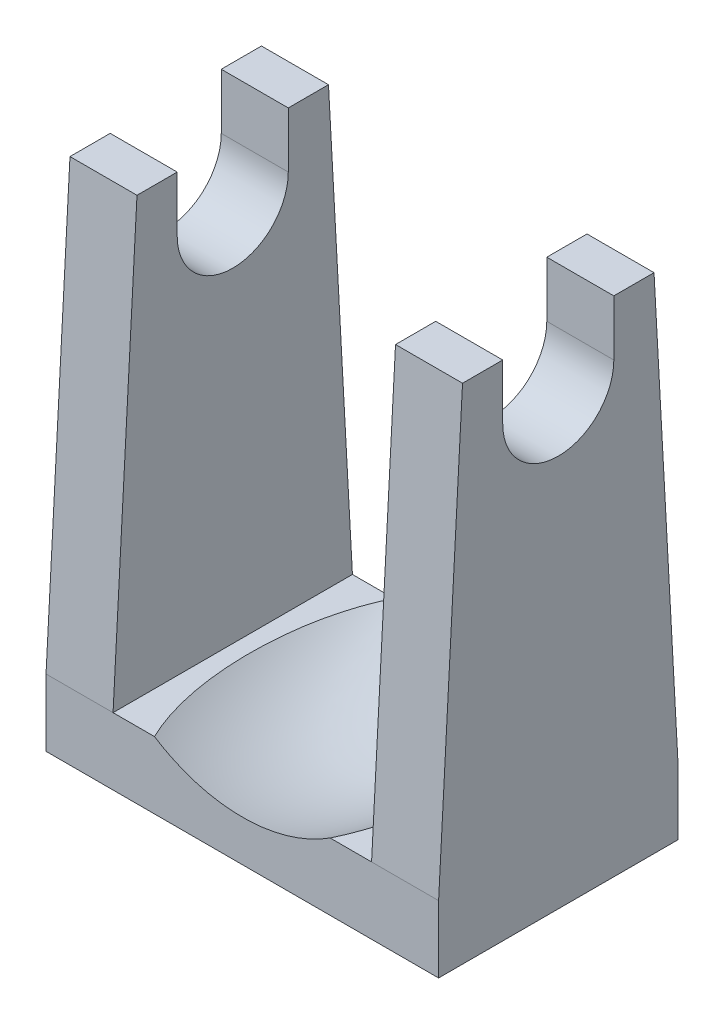
ISO-10303-21;
HEADER;
FILE_DESCRIPTION(('STEP AP214'),'2;1');
FILE_NAME('part.step','',(''),(''),'','','');
FILE_SCHEMA(('AUTOMOTIVE_DESIGN { 1 0 10303 214 1 1 1 1 }'));
ENDSEC;
DATA;
#1=APPLICATION_CONTEXT('core data for automotive mechanical design processes');
#2=APPLICATION_PROTOCOL_DEFINITION('international standard','automotive_design',2000,#1);
#3=PRODUCT_CONTEXT('',#1,'mechanical');
#4=PRODUCT('Part','Part','',(#3));
#5=PRODUCT_RELATED_PRODUCT_CATEGORY('part','',(#4));
#6=PRODUCT_DEFINITION_FORMATION('','',#4);
#7=PRODUCT_DEFINITION_CONTEXT('part definition',#1,'design');
#8=PRODUCT_DEFINITION('design','',#6,#7);
#9=PRODUCT_DEFINITION_SHAPE('','',#8);
#10=(LENGTH_UNIT() NAMED_UNIT(*) SI_UNIT(.MILLI.,.METRE.));
#11=(NAMED_UNIT(*) PLANE_ANGLE_UNIT() SI_UNIT($,.RADIAN.));
#12=(NAMED_UNIT(*) SI_UNIT($,.STERADIAN.) SOLID_ANGLE_UNIT());
#13=UNCERTAINTY_MEASURE_WITH_UNIT(LENGTH_MEASURE(1.E-05),#10,'distance_accuracy_value','');
#14=(GEOMETRIC_REPRESENTATION_CONTEXT(3) GLOBAL_UNCERTAINTY_ASSIGNED_CONTEXT((#13)) GLOBAL_UNIT_ASSIGNED_CONTEXT((#10,
#11,#12)) REPRESENTATION_CONTEXT('',''));
#15=CARTESIAN_POINT('',(0.,0.,0.));
#16=DIRECTION('',(0.,0.,1.));
#17=DIRECTION('',(1.,0.,0.));
#18=AXIS2_PLACEMENT_3D('',#15,#16,#17);
#19=CARTESIAN_POINT('',(-3.429,1.778,3.175));
#20=DIRECTION('',(0.,-1.,0.));
#21=DIRECTION('',(0.,0.,-1.));
#22=AXIS2_PLACEMENT_3D('',#19,#20,#21);
#23=PLANE('',#22);
#24=DIRECTION('',(-1.,0.,0.));
#25=VECTOR('',#24,1.);
#26=CARTESIAN_POINT('',(-3.429,1.778,3.175));
#27=LINE('',#26,#25);
#28=CARTESIAN_POINT('',(-2.33012916433058,1.778,3.175));
#29=VERTEX_POINT('',#28);
#30=CARTESIAN_POINT('',(-3.429,1.778,3.175));
#31=VERTEX_POINT('',#30);
#32=EDGE_CURVE('E193',#29,#31,#27,.T.);
#33=ORIENTED_EDGE('',*,*,#32,.F.);
#34=CARTESIAN_POINT('',(2.98438116142537,1.778,0.));
#35=CARTESIAN_POINT('',(2.98438272635959,1.778,0.188375752277281));
#36=CARTESIAN_POINT('',(2.97853054675383,1.778,0.376762294481809));
#37=CARTESIAN_POINT('',(2.95489329729941,1.778,0.752833492124692));
#38=CARTESIAN_POINT('',(2.93710543895308,1.778,0.940517973236571));
#39=CARTESIAN_POINT('',(2.88891956149637,1.778,1.31412711390979));
#40=CARTESIAN_POINT('',(2.85853231048301,1.778,1.50005313788849));
#41=CARTESIAN_POINT('',(2.78399985130601,1.778,1.86906268777694));
#42=CARTESIAN_POINT('',(2.73986120685217,1.778,2.05214752614319));
#43=CARTESIAN_POINT('',(2.62543525306633,1.778,2.45149675806916));
#44=CARTESIAN_POINT('',(2.55162542716161,1.778,2.66677868343442));
#45=CARTESIAN_POINT('',(2.37774587960668,1.778,3.08664930500776));
#46=CARTESIAN_POINT('',(2.27769213710583,1.778,3.29124441751451));
#47=CARTESIAN_POINT('',(2.06733376315394,1.778,3.64778486721544));
#48=CARTESIAN_POINT('',(1.96200280516021,1.778,3.80262871889689));
#49=CARTESIAN_POINT('',(1.72816604783605,1.778,4.09381598928918));
#50=CARTESIAN_POINT('',(1.59970584633227,1.778,4.2301948998803));
#51=CARTESIAN_POINT('',(1.35920540316977,1.778,4.44018988243004));
#52=CARTESIAN_POINT('',(1.25309609429582,1.778,4.5205685007959));
#53=CARTESIAN_POINT('',(1.02931463200035,1.778,4.6634022670725));
#54=CARTESIAN_POINT('',(0.911648926005241,1.778,4.72586733372503));
#55=CARTESIAN_POINT('',(0.665681704602969,1.778,4.82910505898052));
#56=CARTESIAN_POINT('',(0.537289945644001,1.778,4.86966648499127));
#57=CARTESIAN_POINT('',(0.275008521425509,1.778,4.92451458026312));
#58=CARTESIAN_POINT('',(0.14112446225444,1.778,4.93882739172373));
#59=CARTESIAN_POINT('',(-0.107765842609485,1.778,4.93976766275565));
#60=CARTESIAN_POINT('',(-0.222772378331092,1.778,4.9300138690261));
#61=CARTESIAN_POINT('',(-0.449376447079669,1.778,4.89091532117441));
#62=CARTESIAN_POINT('',(-0.56097390510031,1.778,4.86157013632783));
#63=CARTESIAN_POINT('',(-0.775974412969873,1.778,4.78596863085079));
#64=CARTESIAN_POINT('',(-0.879487474284177,1.778,4.74002054680641));
#65=CARTESIAN_POINT('',(-1.07875024997038,1.778,4.63369918691537));
#66=CARTESIAN_POINT('',(-1.17449691694084,1.778,4.57332028498342));
#67=CARTESIAN_POINT('',(-1.40274695752104,1.778,4.40781133679853));
#68=CARTESIAN_POINT('',(-1.52993205295908,1.778,4.29533744069146));
#69=CARTESIAN_POINT('',(-1.76471634930494,1.778,4.0515290543505));
#70=CARTESIAN_POINT('',(-1.87226749759353,1.778,3.92014966186016));
#71=CARTESIAN_POINT('',(-2.11922811867788,1.778,3.57404191351486));
#72=CARTESIAN_POINT('',(-2.2468953866249,1.778,3.35098771388371));
#73=CARTESIAN_POINT('',(-2.46683088735922,1.778,2.88827173205634));
#74=CARTESIAN_POINT('',(-2.55902905089879,1.778,2.6485781696899));
#75=CARTESIAN_POINT('',(-2.70019314881656,1.778,2.20287899437022));
#76=CARTESIAN_POINT('',(-2.75390391604966,1.778,1.99833129421325));
#77=CARTESIAN_POINT('',(-2.84366524270527,1.778,1.58530553226664));
#78=CARTESIAN_POINT('',(-2.87970371777699,1.778,1.37682488200001));
#79=CARTESIAN_POINT('',(-2.93590986825146,1.778,0.957050130852615));
#80=CARTESIAN_POINT('',(-2.95602272489735,1.778,0.745748836202624));
#81=CARTESIAN_POINT('',(-2.98116099586802,1.778,0.322323616670094));
#82=CARTESIAN_POINT('',(-2.98619035113952,1.778,0.110199921166225));
#83=CARTESIAN_POINT('',(-2.98128641807067,1.778,-0.32649510456757));
#84=CARTESIAN_POINT('',(-2.97044610573199,1.778,-0.55105696751252));
#85=CARTESIAN_POINT('',(-2.93152021229603,1.778,-0.998816015956261));
#86=CARTESIAN_POINT('',(-2.90342663145885,1.778,-1.22201251987289));
#87=CARTESIAN_POINT('',(-2.82863180914895,1.778,-1.66411508569352));
#88=CARTESIAN_POINT('',(-2.7820294151986,1.778,-1.88303755991614));
#89=CARTESIAN_POINT('',(-2.66778514033962,1.778,-2.31518703242224));
#90=CARTESIAN_POINT('',(-2.60016861819189,1.778,-2.52842056084824));
#91=CARTESIAN_POINT('',(-2.45074083892586,1.778,-2.91877723824966));
#92=CARTESIAN_POINT('',(-2.3718791386167,1.778,-3.09701424431371));
#93=CARTESIAN_POINT('',(-2.19264958802553,1.778,-3.44282784447795));
#94=CARTESIAN_POINT('',(-2.09225751238631,1.778,-3.61039215221711));
#95=CARTESIAN_POINT('',(-1.86561812436685,1.778,-3.93082410091077));
#96=CARTESIAN_POINT('',(-1.73903845538131,1.778,-4.08346146219153));
#97=CARTESIAN_POINT('',(-1.45894217611175,1.778,-4.36162880585181));
#98=CARTESIAN_POINT('',(-1.30552899861628,1.778,-4.48725888943294));
#99=CARTESIAN_POINT('',(-1.03730929838843,1.778,-4.65820157668542));
#100=CARTESIAN_POINT('',(-0.930328115089778,1.778,-4.71582533368597));
#101=CARTESIAN_POINT('',(-0.708349481951244,1.778,-4.8128692304437));
#102=CARTESIAN_POINT('',(-0.593357958767572,1.778,-4.85230266753396));
#103=CARTESIAN_POINT('',(-0.3574461675898,1.778,-4.91036116913119));
#104=CARTESIAN_POINT('',(-0.236495152339304,1.778,-4.92886315794765));
#105=CARTESIAN_POINT('',(0.00674519495167258,1.778,-4.94310349441751));
#106=CARTESIAN_POINT('',(0.129034195322047,1.778,-4.93884736142011));
#107=CARTESIAN_POINT('',(0.360360290894705,1.778,-4.90929060122634));
#108=CARTESIAN_POINT('',(0.469638245756384,1.778,-4.88581529919473));
#109=CARTESIAN_POINT('',(0.683008609989167,1.778,-4.8217381072197));
#110=CARTESIAN_POINT('',(0.787100080621293,1.778,-4.78113312935321));
#111=CARTESIAN_POINT('',(0.993430259629429,1.778,-4.68256678262549));
#112=CARTESIAN_POINT('',(1.09528202517341,1.778,-4.62380328959848));
#113=CARTESIAN_POINT('',(1.28984264952473,1.778,-4.49280988846548));
#114=CARTESIAN_POINT('',(1.38254710659762,1.778,-4.42057354500668));
#115=CARTESIAN_POINT('',(1.61174022479799,1.778,-4.21832294993521));
#116=CARTESIAN_POINT('',(1.74074017799112,1.778,-4.07981331581754));
#117=CARTESIAN_POINT('',(1.97536300717008,1.778,-3.78413330923895));
#118=CARTESIAN_POINT('',(2.08091732250443,1.778,-3.62691022074898));
#119=CARTESIAN_POINT('',(2.25025833062576,1.778,-3.33576636853946));
#120=CARTESIAN_POINT('',(2.31813981769369,1.778,-3.20417377125563));
#121=CARTESIAN_POINT('',(2.44222699894319,1.778,-2.935534530963));
#122=CARTESIAN_POINT('',(2.4984255114953,1.778,-2.79848459458541));
#123=CARTESIAN_POINT('',(2.60031203371731,1.778,-2.52042327023397));
#124=CARTESIAN_POINT('',(2.64598965151788,1.778,-2.37940811858745));
#125=CARTESIAN_POINT('',(2.72777198830576,1.778,-2.09468235512664));
#126=CARTESIAN_POINT('',(2.76387847212189,1.778,-1.9509722454778));
#127=CARTESIAN_POINT('',(2.82811409645471,1.778,-1.6582194036479));
#128=CARTESIAN_POINT('',(2.85603354977997,1.778,-1.50913106146254));
#129=CARTESIAN_POINT('',(2.9034177410827,1.778,-1.20958643268488));
#130=CARTESIAN_POINT('',(2.92288004918409,1.778,-1.05912976561035));
#131=CARTESIAN_POINT('',(2.95382603599382,1.778,-0.757405342928155));
#132=CARTESIAN_POINT('',(2.96530975459527,1.778,-0.606137591379734));
#133=CARTESIAN_POINT('',(2.98058599786904,1.778,-0.303248844667521));
#134=CARTESIAN_POINT('',(2.98437990177431,1.778,-0.151627917733611));
#135=CARTESIAN_POINT('',(2.98438116142537,1.778,0.));
#136=B_SPLINE_CURVE_WITH_KNOTS('',3,(#34,#35,#36,#37,#38,#39,#40,#41,#42,#43,#44,#45,#46,#47,
#48,#49,#50,#51,#52,#53,#54,#55,#56,#57,#58,#59,#60,#61,#62,#63,#64,#65,#66,#67,#68,#69,#70,#71,
#72,#73,#74,#75,#76,#77,#78,#79,#80,#81,#82,#83,#84,#85,#86,#87,#88,#89,#90,#91,#92,#93,#94,#95,
#96,#97,#98,#99,#100,#101,#102,#103,#104,#105,#106,#107,#108,#109,#110,#111,#112,#113,#114,#115,
#116,#117,#118,#119,#120,#121,#122,#123,#124,#125,#126,#127,#128,#129,#130,#131,#132,#133,#134,
#135),.UNSPECIFIED.,.T.,.F.,(4,2,2,2,2,2,2,2,2,2,2,2,2,2,2,2,2,2,2,2,2,2,2,2,2,2,2,2,2,2,2,2,2,
2,2,2,2,2,2,2,2,2,2,2,2,2,2,2,2,2,4),(0.,0.565052206929372,1.13023647133593,1.69493869225983,
2.25937178572984,2.94071710312844,3.62164852851744,4.18168751529776,4.74063427491599,
5.13855701621915,5.53625900022334,5.93773076100263,6.33880246004008,6.68332872933179,
7.02786257341881,7.36630362108927,7.70487683127121,8.21134974168912,8.71904605777397,
9.4857711437014,10.2540032115793,10.8876007408403,11.5216309233682,12.157834174318,
12.7938711865692,13.4677091367364,14.1418597582316,14.8124574308279,15.4822489826829,
16.0657808175219,16.6499727028836,17.242091762273,17.8319768035689,18.1951331529826,
18.5580236085849,18.9230369255824,19.2879617227722,19.6217708087132,19.9556400952996,
20.3071097614319,20.6587477401953,21.2233630161322,21.7896082391106,22.2332143425222,
22.6770923334937,23.1214068964601,23.5656394748406,24.0204161129767,24.4753233296194,
24.9302282717005,25.3850516155317),.UNSPECIFIED.);
#137=CARTESIAN_POINT('',(-2.33012916433042,1.778,-3.17500000000018));
#138=VERTEX_POINT('',#137);
#139=EDGE_CURVE('E53',#29,#138,#136,.T.);
#140=ORIENTED_EDGE('',*,*,#139,.T.);
#141=DIRECTION('',(-1.,0.,0.));
#142=VECTOR('',#141,1.);
#143=CARTESIAN_POINT('',(-3.429,1.778,-3.175));
#144=LINE('',#143,#142);
#145=CARTESIAN_POINT('',(-3.429,1.778,-3.175));
#146=VERTEX_POINT('',#145);
#147=EDGE_CURVE('E210',#138,#146,#144,.T.);
#148=ORIENTED_EDGE('',*,*,#147,.T.);
#149=DIRECTION('',(0.,0.,-1.));
#150=VECTOR('',#149,1.);
#151=CARTESIAN_POINT('',(-3.429,1.778,3.175));
#152=LINE('',#151,#150);
#153=EDGE_CURVE('E216',#31,#146,#152,.T.);
#154=ORIENTED_EDGE('',*,*,#153,.F.);
#155=EDGE_LOOP('',(#33,#140,#148,#154));
#156=FACE_BOUND('',#155,.T.);
#157=ADVANCED_FACE('F32',(#156),#23,.F.);
#158=CARTESIAN_POINT('',(5.207,13.3472,3.175));
#159=DIRECTION('',(0.,-1.,0.));
#160=DIRECTION('',(1.,0.,0.));
#161=AXIS2_PLACEMENT_3D('',#158,#159,#160);
#162=PLANE('',#161);
#163=DIRECTION('',(1.,0.,0.));
#164=VECTOR('',#163,1.);
#165=CARTESIAN_POINT('',(-5.207,13.3472,-2.54));
#166=LINE('',#165,#164);
#167=CARTESIAN_POINT('',(3.429,13.3472,-2.54));
#168=VERTEX_POINT('',#167);
#169=CARTESIAN_POINT('',(5.207,13.3472,-2.54));
#170=VERTEX_POINT('',#169);
#171=EDGE_CURVE('E266',#168,#170,#166,.T.);
#172=ORIENTED_EDGE('',*,*,#171,.F.);
#173=DIRECTION('',(0.,0.,-1.));
#174=VECTOR('',#173,1.);
#175=CARTESIAN_POINT('',(3.429,13.3472,3.175));
#176=LINE('',#175,#174);
#177=CARTESIAN_POINT('',(3.429,13.3472,-1.4732));
#178=VERTEX_POINT('',#177);
#179=EDGE_CURVE('E221',#178,#168,#176,.T.);
#180=ORIENTED_EDGE('',*,*,#179,.F.);
#181=DIRECTION('',(1.,0.,0.));
#182=VECTOR('',#181,1.);
#183=CARTESIAN_POINT('',(-5.207,13.3472,-1.4732));
#184=LINE('',#183,#182);
#185=CARTESIAN_POINT('',(5.207,13.3472,-1.4732));
#186=VERTEX_POINT('',#185);
#187=EDGE_CURVE('E318',#178,#186,#184,.T.);
#188=ORIENTED_EDGE('',*,*,#187,.T.);
#189=DIRECTION('',(0.,0.,-1.));
#190=VECTOR('',#189,1.);
#191=CARTESIAN_POINT('',(5.207,13.3472,3.175));
#192=LINE('',#191,#190);
#193=EDGE_CURVE('E224',#186,#170,#192,.T.);
#194=ORIENTED_EDGE('',*,*,#193,.T.);
#195=EDGE_LOOP('',(#172,#180,#188,#194));
#196=FACE_BOUND('',#195,.T.);
#197=ADVANCED_FACE('F413',(#196),#162,.F.);
#198=CARTESIAN_POINT('',(-5.207,13.3472,3.175));
#199=DIRECTION('',(0.,-1.,0.));
#200=DIRECTION('',(0.,0.,-1.));
#201=AXIS2_PLACEMENT_3D('',#198,#199,#200);
#202=PLANE('',#201);
#203=CARTESIAN_POINT('',(-5.207,13.3472,-2.54));
#204=VERTEX_POINT('',#203);
#205=CARTESIAN_POINT('',(-3.429,13.3472,-2.54));
#206=VERTEX_POINT('',#205);
#207=EDGE_CURVE('E272',#204,#206,#166,.T.);
#208=ORIENTED_EDGE('',*,*,#207,.F.);
#209=DIRECTION('',(0.,0.,-1.));
#210=VECTOR('',#209,1.);
#211=CARTESIAN_POINT('',(-5.207,13.3472,3.175));
#212=LINE('',#211,#210);
#213=CARTESIAN_POINT('',(-5.207,13.3472,-1.4732));
#214=VERTEX_POINT('',#213);
#215=EDGE_CURVE('E192',#214,#204,#212,.T.);
#216=ORIENTED_EDGE('',*,*,#215,.F.);
#217=CARTESIAN_POINT('',(-3.429,13.3472,-1.4732));
#218=VERTEX_POINT('',#217);
#219=EDGE_CURVE('E314',#214,#218,#184,.T.);
#220=ORIENTED_EDGE('',*,*,#219,.T.);
#221=DIRECTION('',(0.,0.,-1.));
#222=VECTOR('',#221,1.);
#223=CARTESIAN_POINT('',(-3.429,13.3472,3.175));
#224=LINE('',#223,#222);
#225=EDGE_CURVE('E213',#218,#206,#224,.T.);
#226=ORIENTED_EDGE('',*,*,#225,.T.);
#227=EDGE_LOOP('',(#208,#216,#220,#226));
#228=FACE_BOUND('',#227,.T.);
#229=ADVANCED_FACE('F364',(#228),#202,.F.);
#230=CARTESIAN_POINT('',(-5.207,0.,3.175));
#231=DIRECTION('',(1.,0.,0.));
#232=DIRECTION('',(0.,0.,-1.));
#233=AXIS2_PLACEMENT_3D('',#230,#231,#232);
#234=PLANE('',#233);
#235=DIRECTION('',(0.,0.998497097232137,0.0548046240658305));
#236=VECTOR('',#235,1.);
#237=CARTESIAN_POINT('',(-5.207,1.778,-3.175));
#238=LINE('',#237,#236);
#239=CARTESIAN_POINT('',(-5.207,1.778,-3.175));
#240=VERTEX_POINT('',#239);
#241=EDGE_CURVE('E260',#240,#204,#238,.T.);
#242=ORIENTED_EDGE('',*,*,#241,.F.);
#243=DIRECTION('',(0.,-1.,0.));
#244=VECTOR('',#243,1.);
#245=CARTESIAN_POINT('',(-5.207,0.,-3.175));
#246=LINE('',#245,#244);
#247=CARTESIAN_POINT('',(-5.207,0.,-3.175));
#248=VERTEX_POINT('',#247);
#249=EDGE_CURVE('E202',#240,#248,#246,.T.);
#250=ORIENTED_EDGE('',*,*,#249,.T.);
#251=DIRECTION('',(0.,0.,-1.));
#252=VECTOR('',#251,1.);
#253=CARTESIAN_POINT('',(-5.207,0.,3.175));
#254=LINE('',#253,#252);
#255=CARTESIAN_POINT('',(-5.207,0.,3.175));
#256=VERTEX_POINT('',#255);
#257=EDGE_CURVE('E230',#256,#248,#254,.T.);
#258=ORIENTED_EDGE('',*,*,#257,.F.);
#259=DIRECTION('',(0.,-1.,0.));
#260=VECTOR('',#259,1.);
#261=CARTESIAN_POINT('',(-5.207,0.,3.175));
#262=LINE('',#261,#260);
#263=CARTESIAN_POINT('',(-5.207,1.778,3.175));
#264=VERTEX_POINT('',#263);
#265=EDGE_CURVE('E211',#264,#256,#262,.T.);
#266=ORIENTED_EDGE('',*,*,#265,.F.);
#267=DIRECTION('',(0.,0.998497097232137,-0.0548046240658305));
#268=VECTOR('',#267,1.);
#269=CARTESIAN_POINT('',(-5.207,1.778,3.175));
#270=LINE('',#269,#268);
#271=CARTESIAN_POINT('',(-5.207,13.3472,2.54));
#272=VERTEX_POINT('',#271);
#273=EDGE_CURVE('E281',#264,#272,#270,.T.);
#274=ORIENTED_EDGE('',*,*,#273,.T.);
#275=CARTESIAN_POINT('',(-5.207,13.3472,1.4732));
#276=VERTEX_POINT('',#275);
#277=EDGE_CURVE('E196',#272,#276,#212,.T.);
#278=ORIENTED_EDGE('',*,*,#277,.T.);
#279=DIRECTION('',(0.,-1.,0.));
#280=VECTOR('',#279,1.);
#281=CARTESIAN_POINT('',(-5.207,13.3472,1.4732));
#282=LINE('',#281,#280);
#283=CARTESIAN_POINT('',(-5.207,11.874,1.4732));
#284=VERTEX_POINT('',#283);
#285=EDGE_CURVE('E305',#276,#284,#282,.T.);
#286=ORIENTED_EDGE('',*,*,#285,.T.);
#287=CARTESIAN_POINT('',(-5.207,11.874,0.));
#288=DIRECTION('',(1.,0.,0.));
#289=DIRECTION('',(0.,0.,-1.));
#290=AXIS2_PLACEMENT_3D('',#287,#288,#289);
#291=CIRCLE('',#290,1.4732);
#292=CARTESIAN_POINT('',(-5.207,11.874,-1.4732));
#293=VERTEX_POINT('',#292);
#294=EDGE_CURVE('E308',#284,#293,#291,.T.);
#295=ORIENTED_EDGE('',*,*,#294,.T.);
#296=DIRECTION('',(0.,1.,0.));
#297=VECTOR('',#296,1.);
#298=CARTESIAN_POINT('',(-5.207,13.3472,-1.4732));
#299=LINE('',#298,#297);
#300=EDGE_CURVE('E311',#293,#214,#299,.T.);
#301=ORIENTED_EDGE('',*,*,#300,.T.);
#302=ORIENTED_EDGE('',*,*,#215,.T.);
#303=EDGE_LOOP('',(#242,#250,#258,#266,#274,#278,#286,#295,#301,#302));
#304=FACE_BOUND('',#303,.T.);
#305=ADVANCED_FACE('F34',(#304),#234,.F.);
#306=CARTESIAN_POINT('',(5.207,0.,3.175));
#307=DIRECTION('',(-1.,0.,0.));
#308=DIRECTION('',(0.,-1.,0.));
#309=AXIS2_PLACEMENT_3D('',#306,#307,#308);
#310=PLANE('',#309);
#311=DIRECTION('',(0.,0.998497097232137,0.0548046240658305));
#312=VECTOR('',#311,1.);
#313=CARTESIAN_POINT('',(5.207,1.778,-3.175));
#314=LINE('',#313,#312);
#315=CARTESIAN_POINT('',(5.207,1.778,-3.175));
#316=VERTEX_POINT('',#315);
#317=EDGE_CURVE('E60',#316,#170,#314,.T.);
#318=ORIENTED_EDGE('',*,*,#317,.T.);
#319=ORIENTED_EDGE('',*,*,#193,.F.);
#320=DIRECTION('',(0.,1.,0.));
#321=VECTOR('',#320,1.);
#322=CARTESIAN_POINT('',(5.207,13.3472,-1.4732));
#323=LINE('',#322,#321);
#324=CARTESIAN_POINT('',(5.207,11.874,-1.4732));
#325=VERTEX_POINT('',#324);
#326=EDGE_CURVE('E303',#325,#186,#323,.T.);
#327=ORIENTED_EDGE('',*,*,#326,.F.);
#328=CARTESIAN_POINT('',(5.207,11.874,0.));
#329=DIRECTION('',(1.,0.,0.));
#330=DIRECTION('',(0.,0.,-1.));
#331=AXIS2_PLACEMENT_3D('',#328,#329,#330);
#332=CIRCLE('',#331,1.4732);
#333=CARTESIAN_POINT('',(5.207,11.874,1.4732));
#334=VERTEX_POINT('',#333);
#335=EDGE_CURVE('E300',#334,#325,#332,.T.);
#336=ORIENTED_EDGE('',*,*,#335,.F.);
#337=DIRECTION('',(0.,-1.,0.));
#338=VECTOR('',#337,1.);
#339=CARTESIAN_POINT('',(5.207,13.3472,1.4732));
#340=LINE('',#339,#338);
#341=CARTESIAN_POINT('',(5.207,13.3472,1.4732));
#342=VERTEX_POINT('',#341);
#343=EDGE_CURVE('E297',#342,#334,#340,.T.);
#344=ORIENTED_EDGE('',*,*,#343,.F.);
#345=CARTESIAN_POINT('',(5.207,13.3472,2.54));
#346=VERTEX_POINT('',#345);
#347=EDGE_CURVE('E225',#346,#342,#192,.T.);
#348=ORIENTED_EDGE('',*,*,#347,.F.);
#349=DIRECTION('',(0.,0.998497097232137,-0.0548046240658305));
#350=VECTOR('',#349,1.);
#351=CARTESIAN_POINT('',(5.207,1.778,3.175));
#352=LINE('',#351,#350);
#353=CARTESIAN_POINT('',(5.207,1.778,3.175));
#354=VERTEX_POINT('',#353);
#355=EDGE_CURVE('E279',#354,#346,#352,.T.);
#356=ORIENTED_EDGE('',*,*,#355,.F.);
#357=DIRECTION('',(0.,1.,0.));
#358=VECTOR('',#357,1.);
#359=CARTESIAN_POINT('',(5.207,0.,3.175));
#360=LINE('',#359,#358);
#361=CARTESIAN_POINT('',(5.207,0.,3.175));
#362=VERTEX_POINT('',#361);
#363=EDGE_CURVE('E198',#362,#354,#360,.T.);
#364=ORIENTED_EDGE('',*,*,#363,.F.);
#365=DIRECTION('',(0.,0.,-1.));
#366=VECTOR('',#365,1.);
#367=CARTESIAN_POINT('',(5.207,0.,3.175));
#368=LINE('',#367,#366);
#369=CARTESIAN_POINT('',(5.207,0.,-3.175));
#370=VERTEX_POINT('',#369);
#371=EDGE_CURVE('E227',#362,#370,#368,.T.);
#372=ORIENTED_EDGE('',*,*,#371,.T.);
#373=DIRECTION('',(0.,1.,0.));
#374=VECTOR('',#373,1.);
#375=CARTESIAN_POINT('',(5.207,0.,-3.175));
#376=LINE('',#375,#374);
#377=EDGE_CURVE('E207',#370,#316,#376,.T.);
#378=ORIENTED_EDGE('',*,*,#377,.T.);
#379=EDGE_LOOP('',(#318,#319,#327,#336,#344,#348,#356,#364,#372,#378));
#380=FACE_BOUND('',#379,.T.);
#381=ADVANCED_FACE('F242',(#380),#310,.F.);
#382=CARTESIAN_POINT('',(3.429,13.3472,3.175));
#383=DIRECTION('',(1.,0.,0.));
#384=DIRECTION('',(0.,1.,0.));
#385=AXIS2_PLACEMENT_3D('',#382,#383,#384);
#386=PLANE('',#385);
#387=DIRECTION('',(0.,0.998497097232137,0.0548046240658305));
#388=VECTOR('',#387,1.);
#389=CARTESIAN_POINT('',(3.429,13.6599377047251,-2.52283472992943));
#390=LINE('',#389,#388);
#391=CARTESIAN_POINT('',(3.429,1.778,-3.175));
#392=VERTEX_POINT('',#391);
#393=EDGE_CURVE('E277',#392,#168,#390,.T.);
#394=ORIENTED_EDGE('',*,*,#393,.F.);
#395=DIRECTION('',(0.,0.,-1.));
#396=VECTOR('',#395,1.);
#397=CARTESIAN_POINT('',(3.429,1.778,3.175));
#398=LINE('',#397,#396);
#399=CARTESIAN_POINT('',(3.429,1.778,3.175));
#400=VERTEX_POINT('',#399);
#401=EDGE_CURVE('E219',#400,#392,#398,.T.);
#402=ORIENTED_EDGE('',*,*,#401,.F.);
#403=DIRECTION('',(0.,0.998497097232137,-0.0548046240658305));
#404=VECTOR('',#403,1.);
#405=CARTESIAN_POINT('',(3.429,13.3124513661417,2.54190725223006));
#406=LINE('',#405,#404);
#407=CARTESIAN_POINT('',(3.429,13.3472,2.54));
#408=VERTEX_POINT('',#407);
#409=EDGE_CURVE('E294',#400,#408,#406,.T.);
#410=ORIENTED_EDGE('',*,*,#409,.T.);
#411=CARTESIAN_POINT('',(3.429,13.3472,1.4732));
#412=VERTEX_POINT('',#411);
#413=EDGE_CURVE('E222',#408,#412,#176,.T.);
#414=ORIENTED_EDGE('',*,*,#413,.T.);
#415=DIRECTION('',(0.,-1.,0.));
#416=VECTOR('',#415,1.);
#417=CARTESIAN_POINT('',(3.429,13.3472,1.4732));
#418=LINE('',#417,#416);
#419=CARTESIAN_POINT('',(3.429,11.874,1.4732));
#420=VERTEX_POINT('',#419);
#421=EDGE_CURVE('E332',#412,#420,#418,.T.);
#422=ORIENTED_EDGE('',*,*,#421,.T.);
#423=CARTESIAN_POINT('',(3.429,11.874,0.));
#424=DIRECTION('',(1.,0.,0.));
#425=DIRECTION('',(0.,1.,0.));
#426=AXIS2_PLACEMENT_3D('',#423,#424,#425);
#427=CIRCLE('',#426,1.4732);
#428=CARTESIAN_POINT('',(3.429,11.874,-1.4732));
#429=VERTEX_POINT('',#428);
#430=EDGE_CURVE('E205',#420,#429,#427,.T.);
#431=ORIENTED_EDGE('',*,*,#430,.T.);
#432=DIRECTION('',(0.,1.,0.));
#433=VECTOR('',#432,1.);
#434=CARTESIAN_POINT('',(3.429,13.3472,-1.4732));
#435=LINE('',#434,#433);
#436=EDGE_CURVE('E338',#429,#178,#435,.T.);
#437=ORIENTED_EDGE('',*,*,#436,.T.);
#438=ORIENTED_EDGE('',*,*,#179,.T.);
#439=EDGE_LOOP('',(#394,#402,#410,#414,#422,#431,#437,#438));
#440=FACE_BOUND('',#439,.T.);
#441=ADVANCED_FACE('F435',(#440),#386,.F.);
#442=CARTESIAN_POINT('',(-3.429,13.3472,3.175));
#443=DIRECTION('',(-1.,0.,0.));
#444=DIRECTION('',(0.,-1.,0.));
#445=AXIS2_PLACEMENT_3D('',#442,#443,#444);
#446=PLANE('',#445);
#447=DIRECTION('',(0.,-0.998497097232137,-0.0548046240658305));
#448=VECTOR('',#447,1.);
#449=CARTESIAN_POINT('',(-3.429,13.6599377047251,-2.52283472992943));
#450=LINE('',#449,#448);
#451=EDGE_CURVE('E273',#206,#146,#450,.T.);
#452=ORIENTED_EDGE('',*,*,#451,.F.);
#453=ORIENTED_EDGE('',*,*,#225,.F.);
#454=DIRECTION('',(0.,-1.,0.));
#455=VECTOR('',#454,1.);
#456=CARTESIAN_POINT('',(-3.429,13.3472,-1.4732));
#457=LINE('',#456,#455);
#458=CARTESIAN_POINT('',(-3.429,11.874,-1.4732));
#459=VERTEX_POINT('',#458);
#460=EDGE_CURVE('E335',#218,#459,#457,.T.);
#461=ORIENTED_EDGE('',*,*,#460,.T.);
#462=CARTESIAN_POINT('',(-3.429,11.874,0.));
#463=DIRECTION('',(-1.,0.,0.));
#464=DIRECTION('',(0.,-1.,0.));
#465=AXIS2_PLACEMENT_3D('',#462,#463,#464);
#466=CIRCLE('',#465,1.4732);
#467=CARTESIAN_POINT('',(-3.429,11.874,1.4732));
#468=VERTEX_POINT('',#467);
#469=EDGE_CURVE('E233',#459,#468,#466,.T.);
#470=ORIENTED_EDGE('',*,*,#469,.T.);
#471=DIRECTION('',(0.,1.,0.));
#472=VECTOR('',#471,1.);
#473=CARTESIAN_POINT('',(-3.429,13.3472,1.4732));
#474=LINE('',#473,#472);
#475=CARTESIAN_POINT('',(-3.429,13.3472,1.4732));
#476=VERTEX_POINT('',#475);
#477=EDGE_CURVE('E317',#468,#476,#474,.T.);
#478=ORIENTED_EDGE('',*,*,#477,.T.);
#479=CARTESIAN_POINT('',(-3.429,13.3472,2.54));
#480=VERTEX_POINT('',#479);
#481=EDGE_CURVE('E214',#480,#476,#224,.T.);
#482=ORIENTED_EDGE('',*,*,#481,.F.);
#483=DIRECTION('',(0.,-0.998497097232137,0.0548046240658305));
#484=VECTOR('',#483,1.);
#485=CARTESIAN_POINT('',(-3.429,13.3124513661417,2.54190725223006));
#486=LINE('',#485,#484);
#487=EDGE_CURVE('E288',#480,#31,#486,.T.);
#488=ORIENTED_EDGE('',*,*,#487,.T.);
#489=ORIENTED_EDGE('',*,*,#153,.T.);
#490=EDGE_LOOP('',(#452,#453,#461,#470,#478,#482,#488,#489));
#491=FACE_BOUND('',#490,.T.);
#492=ADVANCED_FACE('F355',(#491),#446,.F.);
#493=CARTESIAN_POINT('',(0.,0.,-3.175));
#494=DIRECTION('',(0.,0.,-1.));
#495=DIRECTION('',(-1.,0.,0.));
#496=AXIS2_PLACEMENT_3D('',#493,#494,#495);
#497=PLANE('',#496);
#498=CARTESIAN_POINT('',(4.06119545006156,8.1220970081502,-3.175));
#499=CARTESIAN_POINT('',(4.09556738892284,8.02370889267765,-3.175));
#500=CARTESIAN_POINT('',(4.12818463936603,7.9247101114785,-3.175));
#501=CARTESIAN_POINT('',(4.18955280837907,7.72548679849691,-3.175));
#502=CARTESIAN_POINT('',(4.21830240773036,7.62526186113683,-3.175));
#503=CARTESIAN_POINT('',(4.29831667176947,7.32232650798311,-3.175));
#504=CARTESIAN_POINT('',(4.34316705570834,7.11785940350068,-3.175));
#505=CARTESIAN_POINT('',(4.41333661281166,6.70448836265178,-3.175));
#506=CARTESIAN_POINT('',(4.43855467564388,6.49556707733204,-3.175));
#507=CARTESIAN_POINT('',(4.46688372472098,6.07640578928607,-3.175));
#508=CARTESIAN_POINT('',(4.47002394482914,5.86616789948072,-3.175));
#509=CARTESIAN_POINT('',(4.45537930270578,5.51322812997984,-3.175));
#510=CARTESIAN_POINT('',(4.44391188500585,5.37024306572581,-3.175));
#511=CARTESIAN_POINT('',(4.40955397924513,5.08562390884476,-3.175));
#512=CARTESIAN_POINT('',(4.38666324144898,4.94398984582218,-3.175));
#513=CARTESIAN_POINT('',(4.32928447567059,4.66350574127615,-3.175));
#514=CARTESIAN_POINT('',(4.29482982564341,4.52464889218034,-3.175));
#515=CARTESIAN_POINT('',(4.21419694354918,4.25037347621343,-3.175));
#516=CARTESIAN_POINT('',(4.16801893337587,4.11495484431887,-3.175));
#517=CARTESIAN_POINT('',(4.0636810140169,3.84792992277019,-3.175));
#518=CARTESIAN_POINT('',(4.00545548478279,3.7163492148112,-3.175));
#519=CARTESIAN_POINT('',(3.87737525388116,3.45897411292156,-3.175));
#520=CARTESIAN_POINT('',(3.80752118929278,3.33317940248176,-3.175));
#521=CARTESIAN_POINT('',(3.65647247606192,3.08845313253978,-3.175));
#522=CARTESIAN_POINT('',(3.57526924729074,2.96952686271645,-3.175));
#523=CARTESIAN_POINT('',(3.40207271144605,2.73981123016151,-3.175));
#524=CARTESIAN_POINT('',(3.31008033494146,2.62902116701676,-3.175));
#525=CARTESIAN_POINT('',(3.12386601804442,2.4253331830048,-3.175));
#526=CARTESIAN_POINT('',(3.03043308922655,2.33171291688925,-3.175));
#527=CARTESIAN_POINT('',(2.83560975103838,2.15307430744529,-3.175));
#528=CARTESIAN_POINT('',(2.73421668778046,2.06805885474986,-3.175));
#529=CARTESIAN_POINT('',(2.5243262485794,1.90751265387763,-3.175));
#530=CARTESIAN_POINT('',(2.41583547988463,1.83197327033168,-3.175));
#531=CARTESIAN_POINT('',(2.19243982195093,1.69095775310949,-3.175));
#532=CARTESIAN_POINT('',(2.07753267921093,1.62548518569964,-3.175));
#533=CARTESIAN_POINT('',(1.8488216715107,1.50861222457813,-3.175));
#534=CARTESIAN_POINT('',(1.73531467805695,1.45663008393924,-3.175));
#535=CARTESIAN_POINT('',(1.50419398097456,1.36263530367874,-3.175));
#536=CARTESIAN_POINT('',(1.38657882395774,1.32062623416646,-3.175));
#537=CARTESIAN_POINT('',(1.14820639129773,1.24698122862257,-3.175));
#538=CARTESIAN_POINT('',(1.02745065837577,1.21534029965898,-3.175));
#539=CARTESIAN_POINT('',(0.783599172280977,1.16266714563259,-3.175));
#540=CARTESIAN_POINT('',(0.660502584423254,1.14163878121861,-3.175));
#541=CARTESIAN_POINT('',(0.416319867617482,1.11081672218187,-3.175));
#542=CARTESIAN_POINT('',(0.295270307487193,1.10073261171172,-3.175));
#543=CARTESIAN_POINT('',(0.0527071742024346,1.09087293368968,-3.175));
#544=CARTESIAN_POINT('',(-0.0688065510181004,1.09110109795051,-3.175));
#545=CARTESIAN_POINT('',(-0.311321563897349,1.10187161435608,-3.175));
#546=CARTESIAN_POINT('',(-0.43232305643338,1.11240935352865,-3.175));
#547=CARTESIAN_POINT('',(-0.673039483527891,1.143709413016,-3.175));
#548=CARTESIAN_POINT('',(-0.792753927047758,1.16447550345227,-3.175));
#549=CARTESIAN_POINT('',(-1.02911582438284,1.21587628435922,-3.175));
#550=CARTESIAN_POINT('',(-1.14577950239875,1.24643614567856,-3.175));
#551=CARTESIAN_POINT('',(-1.37615328959481,1.31721145183026,-3.175));
#552=CARTESIAN_POINT('',(-1.48986230843468,1.3574304065604,-3.175));
#553=CARTESIAN_POINT('',(-1.82527482572315,1.49211127501214,-3.175));
#554=CARTESIAN_POINT('',(-2.04151233145818,1.60065164397296,-3.175));
#555=CARTESIAN_POINT('',(-2.45513530053728,1.85297954061266,-3.175));
#556=CARTESIAN_POINT('',(-2.65231064599912,1.99710864831875,-3.175));
#557=CARTESIAN_POINT('',(-3.02051169789251,2.31559271688473,-3.175));
#558=CARTESIAN_POINT('',(-3.19153572906461,2.48994961261857,-3.175));
#559=CARTESIAN_POINT('',(-3.50799798771624,2.86902331951539,-3.175));
#560=CARTESIAN_POINT('',(-3.65256705224828,3.07446437538151,-3.175));
#561=CARTESIAN_POINT('',(-3.90714030235635,3.50572105366013,-3.175));
#562=CARTESIAN_POINT('',(-4.01713634714568,3.73154145863839,-3.175));
#563=CARTESIAN_POINT('',(-4.20609388749508,4.20972325796875,-3.175));
#564=CARTESIAN_POINT('',(-4.28308955667452,4.46285770975728,-3.175));
#565=CARTESIAN_POINT('',(-4.39731833420678,4.97789556389081,-3.175));
#566=CARTESIAN_POINT('',(-4.43455069654232,5.23979913066204,-3.175));
#567=CARTESIAN_POINT('',(-4.46279190369369,5.64657893698245,-3.175));
#568=CARTESIAN_POINT('',(-4.46710290446181,5.79069159532235,-3.175));
#569=CARTESIAN_POINT('',(-4.46489495516359,6.07882992086383,-3.175));
#570=CARTESIAN_POINT('',(-4.45837777206992,6.22285559842272,-3.175));
#571=CARTESIAN_POINT('',(-4.4350819022781,6.5101955448053,-3.175));
#572=CARTESIAN_POINT('',(-4.41829304849514,6.65350896675636,-3.175));
#573=CARTESIAN_POINT('',(-4.37515277288222,6.93865434333099,-3.175));
#574=CARTESIAN_POINT('',(-4.34880286648859,7.08048652906884,-3.175));
#575=CARTESIAN_POINT('',(-4.28470415972595,7.37424455692271,-3.175));
#576=CARTESIAN_POINT('',(-4.24617414933604,7.52599815927547,-3.175));
#577=CARTESIAN_POINT('',(-4.16012330499681,7.8263469505513,-3.175));
#578=CARTESIAN_POINT('',(-4.1126357488455,7.97495163443535,-3.175));
#579=CARTESIAN_POINT('',(-4.06119545006157,8.1220970081502,-3.175));
#580=B_SPLINE_CURVE_WITH_KNOTS('',3,(#498,#499,#500,#501,#502,#503,#504,#505,#506,#507,#508,
#509,#510,#511,#512,#513,#514,#515,#516,#517,#518,#519,#520,#521,#522,#523,#524,#525,#526,#527,
#528,#529,#530,#531,#532,#533,#534,#535,#536,#537,#538,#539,#540,#541,#542,#543,#544,#545,#546,
#547,#548,#549,#550,#551,#552,#553,#554,#555,#556,#557,#558,#559,#560,#561,#562,#563,#564,#565,
#566,#567,#568,#569,#570,#571,#572,#573,#574,#575,#576,#577,#578,#579),.UNSPECIFIED.,.F.,.F.,(4,
2,2,2,2,2,2,2,2,2,2,2,2,2,2,2,2,2,2,2,2,2,2,2,2,2,2,2,2,2,2,2,2,2,2,2,2,2,2,2,4),(0.,
0.312629374780401,0.625365115518214,1.25243668984088,1.88271682560649,2.51216223310422,
2.94208172385168,3.37201061386353,3.80070908362797,4.22939943981278,4.66048932365146,
5.09155559763488,5.52294954462701,5.95430631101909,6.35060112794068,6.74702863421139,
7.14309221769554,7.53929578882804,7.91336907305412,8.28757606489374,8.66160258606055,
9.03576507305063,9.39973586125003,9.76383836449061,10.1277780262054,10.4918519348443,
10.8532079303068,11.2146954336351,11.9369166090281,12.6663591768629,13.3958484534043,
14.1461499164654,14.896627918235,15.6870923252774,16.4775715623176,16.9097535397077,
17.3418649993865,17.7744048643047,18.2068762011515,18.6762754846635,19.1439640945667),.UNSPECIFIED.);
#581=CARTESIAN_POINT('',(2.33012916433051,1.778,-3.17499999999998));
#582=VERTEX_POINT('',#581);
#583=EDGE_CURVE('E268',#582,#138,#580,.T.);
#584=ORIENTED_EDGE('',*,*,#583,.F.);
#585=EDGE_CURVE('E185',#392,#582,#144,.T.);
#586=ORIENTED_EDGE('',*,*,#585,.F.);
#587=DIRECTION('',(1.,0.,0.));
#588=VECTOR('',#587,1.);
#589=CARTESIAN_POINT('',(0.,1.778,-3.175));
#590=LINE('',#589,#588);
#591=EDGE_CURVE('E46',#392,#316,#590,.T.);
#592=ORIENTED_EDGE('',*,*,#591,.T.);
#593=ORIENTED_EDGE('',*,*,#377,.F.);
#594=DIRECTION('',(1.,0.,0.));
#595=VECTOR('',#594,1.);
#596=CARTESIAN_POINT('',(5.207,0.,-3.175));
#597=LINE('',#596,#595);
#598=EDGE_CURVE('E204',#248,#370,#597,.T.);
#599=ORIENTED_EDGE('',*,*,#598,.F.);
#600=ORIENTED_EDGE('',*,*,#249,.F.);
#601=DIRECTION('',(1.,0.,0.));
#602=VECTOR('',#601,1.);
#603=CARTESIAN_POINT('',(-5.207,1.778,-3.175));
#604=LINE('',#603,#602);
#605=EDGE_CURVE('E256',#240,#146,#604,.T.);
#606=ORIENTED_EDGE('',*,*,#605,.T.);
#607=ORIENTED_EDGE('',*,*,#147,.F.);
#608=EDGE_LOOP('',(#584,#586,#592,#593,#599,#600,#606,#607));
#609=FACE_BOUND('',#608,.T.);
#610=ADVANCED_FACE('F238',(#609),#497,.T.);
#611=CARTESIAN_POINT('',(5.207,0.,3.175));
#612=DIRECTION('',(0.,1.,0.));
#613=DIRECTION('',(0.,0.,1.));
#614=AXIS2_PLACEMENT_3D('',#611,#612,#613);
#615=PLANE('',#614);
#616=ORIENTED_EDGE('',*,*,#598,.T.);
#617=ORIENTED_EDGE('',*,*,#371,.F.);
#618=DIRECTION('',(1.,0.,0.));
#619=VECTOR('',#618,1.);
#620=CARTESIAN_POINT('',(5.207,0.,3.175));
#621=LINE('',#620,#619);
#622=EDGE_CURVE('E251',#256,#362,#621,.T.);
#623=ORIENTED_EDGE('',*,*,#622,.F.);
#624=ORIENTED_EDGE('',*,*,#257,.T.);
#625=EDGE_LOOP('',(#616,#617,#623,#624));
#626=FACE_BOUND('',#625,.T.);
#627=ADVANCED_FACE('F250',(#626),#615,.F.);
#628=ORIENTED_EDGE('',*,*,#413,.F.);
#629=DIRECTION('',(1.,0.,0.));
#630=VECTOR('',#629,1.);
#631=CARTESIAN_POINT('',(-5.207,13.3472,2.54));
#632=LINE('',#631,#630);
#633=EDGE_CURVE('E284',#408,#346,#632,.T.);
#634=ORIENTED_EDGE('',*,*,#633,.T.);
#635=ORIENTED_EDGE('',*,*,#347,.T.);
#636=DIRECTION('',(1.,0.,0.));
#637=VECTOR('',#636,1.);
#638=CARTESIAN_POINT('',(-5.207,13.3472,1.4732));
#639=LINE('',#638,#637);
#640=EDGE_CURVE('E313',#412,#342,#639,.T.);
#641=ORIENTED_EDGE('',*,*,#640,.F.);
#642=EDGE_LOOP('',(#628,#634,#635,#641));
#643=FACE_BOUND('',#642,.T.);
#644=ADVANCED_FACE('F421',(#643),#162,.F.);
#645=ORIENTED_EDGE('',*,*,#585,.T.);
#646=CARTESIAN_POINT('',(2.3301291643305,1.778,3.175));
#647=VERTEX_POINT('',#646);
#648=EDGE_CURVE('E173',#582,#647,#136,.T.);
#649=ORIENTED_EDGE('',*,*,#648,.T.);
#650=EDGE_CURVE('E183',#400,#647,#27,.T.);
#651=ORIENTED_EDGE('',*,*,#650,.F.);
#652=ORIENTED_EDGE('',*,*,#401,.T.);
#653=EDGE_LOOP('',(#645,#649,#651,#652));
#654=FACE_BOUND('',#653,.T.);
#655=ADVANCED_FACE('F181',(#654),#23,.F.);
#656=ORIENTED_EDGE('',*,*,#277,.F.);
#657=EDGE_CURVE('E289',#272,#480,#632,.T.);
#658=ORIENTED_EDGE('',*,*,#657,.T.);
#659=ORIENTED_EDGE('',*,*,#481,.T.);
#660=EDGE_CURVE('E327',#276,#476,#639,.T.);
#661=ORIENTED_EDGE('',*,*,#660,.F.);
#662=EDGE_LOOP('',(#656,#658,#659,#661));
#663=FACE_BOUND('',#662,.T.);
#664=ADVANCED_FACE('F349',(#663),#202,.F.);
#665=CARTESIAN_POINT('',(0.,0.,3.175));
#666=DIRECTION('',(0.,0.,-1.));
#667=DIRECTION('',(-1.,0.,0.));
#668=AXIS2_PLACEMENT_3D('',#665,#666,#667);
#669=PLANE('',#668);
#670=ORIENTED_EDGE('',*,*,#650,.T.);
#671=CARTESIAN_POINT('',(4.06119545006156,8.1220970081502,3.175));
#672=CARTESIAN_POINT('',(4.09556738892284,8.02370889267765,3.175));
#673=CARTESIAN_POINT('',(4.12818463936603,7.9247101114785,3.175));
#674=CARTESIAN_POINT('',(4.18955280837907,7.72548679849691,3.175));
#675=CARTESIAN_POINT('',(4.21830240773036,7.62526186113683,3.175));
#676=CARTESIAN_POINT('',(4.29831667176947,7.32232650798311,3.175));
#677=CARTESIAN_POINT('',(4.34316705570834,7.11785940350068,3.175));
#678=CARTESIAN_POINT('',(4.41333661281166,6.70448836265178,3.175));
#679=CARTESIAN_POINT('',(4.43855467564388,6.49556707733204,3.175));
#680=CARTESIAN_POINT('',(4.46688372472098,6.07640578928607,3.175));
#681=CARTESIAN_POINT('',(4.47002394482914,5.86616789948072,3.175));
#682=CARTESIAN_POINT('',(4.45537930270578,5.51322812997984,3.175));
#683=CARTESIAN_POINT('',(4.44391188500585,5.37024306572581,3.175));
#684=CARTESIAN_POINT('',(4.40955397924513,5.08562390884476,3.175));
#685=CARTESIAN_POINT('',(4.38666324144898,4.94398984582218,3.175));
#686=CARTESIAN_POINT('',(4.32928447567059,4.66350574127615,3.175));
#687=CARTESIAN_POINT('',(4.29482982564341,4.52464889218034,3.175));
#688=CARTESIAN_POINT('',(4.21419694354918,4.25037347621343,3.175));
#689=CARTESIAN_POINT('',(4.16801893337587,4.11495484431887,3.175));
#690=CARTESIAN_POINT('',(4.0636810140169,3.84792992277019,3.175));
#691=CARTESIAN_POINT('',(4.00545548478279,3.7163492148112,3.175));
#692=CARTESIAN_POINT('',(3.87737525388116,3.45897411292156,3.175));
#693=CARTESIAN_POINT('',(3.80752118929278,3.33317940248176,3.175));
#694=CARTESIAN_POINT('',(3.65647247606192,3.08845313253978,3.175));
#695=CARTESIAN_POINT('',(3.57526924729074,2.96952686271645,3.175));
#696=CARTESIAN_POINT('',(3.40207271144605,2.73981123016151,3.175));
#697=CARTESIAN_POINT('',(3.31008033494146,2.62902116701676,3.175));
#698=CARTESIAN_POINT('',(3.12386601804442,2.4253331830048,3.175));
#699=CARTESIAN_POINT('',(3.03043308922655,2.33171291688925,3.175));
#700=CARTESIAN_POINT('',(2.83560975103838,2.15307430744529,3.175));
#701=CARTESIAN_POINT('',(2.73421668778046,2.06805885474986,3.175));
#702=CARTESIAN_POINT('',(2.5243262485794,1.90751265387763,3.175));
#703=CARTESIAN_POINT('',(2.41583547988463,1.83197327033168,3.175));
#704=CARTESIAN_POINT('',(2.19243982195093,1.69095775310949,3.175));
#705=CARTESIAN_POINT('',(2.07753267921093,1.62548518569964,3.175));
#706=CARTESIAN_POINT('',(1.8488216715107,1.50861222457813,3.175));
#707=CARTESIAN_POINT('',(1.73531467805695,1.45663008393924,3.175));
#708=CARTESIAN_POINT('',(1.50419398097456,1.36263530367874,3.175));
#709=CARTESIAN_POINT('',(1.38657882395774,1.32062623416646,3.175));
#710=CARTESIAN_POINT('',(1.14820639129773,1.24698122862257,3.175));
#711=CARTESIAN_POINT('',(1.02745065837577,1.21534029965898,3.175));
#712=CARTESIAN_POINT('',(0.783599172280977,1.16266714563259,3.175));
#713=CARTESIAN_POINT('',(0.660502584423254,1.14163878121861,3.175));
#714=CARTESIAN_POINT('',(0.416319867617482,1.11081672218187,3.175));
#715=CARTESIAN_POINT('',(0.295270307487193,1.10073261171172,3.175));
#716=CARTESIAN_POINT('',(0.0527071742024346,1.09087293368968,3.175));
#717=CARTESIAN_POINT('',(-0.0688065510181004,1.09110109795051,3.175));
#718=CARTESIAN_POINT('',(-0.311321563897349,1.10187161435608,3.175));
#719=CARTESIAN_POINT('',(-0.43232305643338,1.11240935352865,3.175));
#720=CARTESIAN_POINT('',(-0.673039483527891,1.143709413016,3.175));
#721=CARTESIAN_POINT('',(-0.792753927047758,1.16447550345227,3.175));
#722=CARTESIAN_POINT('',(-1.02911582438284,1.21587628435922,3.175));
#723=CARTESIAN_POINT('',(-1.14577950239875,1.24643614567856,3.175));
#724=CARTESIAN_POINT('',(-1.37615328959481,1.31721145183026,3.175));
#725=CARTESIAN_POINT('',(-1.48986230843468,1.3574304065604,3.175));
#726=CARTESIAN_POINT('',(-1.82527482572315,1.49211127501214,3.175));
#727=CARTESIAN_POINT('',(-2.04151233145818,1.60065164397296,3.175));
#728=CARTESIAN_POINT('',(-2.45513530053728,1.85297954061266,3.175));
#729=CARTESIAN_POINT('',(-2.65231064599912,1.99710864831875,3.175));
#730=CARTESIAN_POINT('',(-3.02051169789251,2.31559271688473,3.175));
#731=CARTESIAN_POINT('',(-3.19153572906461,2.48994961261857,3.175));
#732=CARTESIAN_POINT('',(-3.50799798771624,2.86902331951539,3.175));
#733=CARTESIAN_POINT('',(-3.65256705224828,3.07446437538151,3.175));
#734=CARTESIAN_POINT('',(-3.90714030235635,3.50572105366013,3.175));
#735=CARTESIAN_POINT('',(-4.01713634714568,3.73154145863839,3.175));
#736=CARTESIAN_POINT('',(-4.20609388749508,4.20972325796875,3.175));
#737=CARTESIAN_POINT('',(-4.28308955667452,4.46285770975728,3.175));
#738=CARTESIAN_POINT('',(-4.39731833420678,4.97789556389081,3.175));
#739=CARTESIAN_POINT('',(-4.43455069654232,5.23979913066204,3.175));
#740=CARTESIAN_POINT('',(-4.46279190369369,5.64657893698245,3.175));
#741=CARTESIAN_POINT('',(-4.46710290446181,5.79069159532235,3.175));
#742=CARTESIAN_POINT('',(-4.46489495516359,6.07882992086383,3.175));
#743=CARTESIAN_POINT('',(-4.45837777206992,6.22285559842272,3.175));
#744=CARTESIAN_POINT('',(-4.4350819022781,6.5101955448053,3.175));
#745=CARTESIAN_POINT('',(-4.41829304849514,6.65350896675636,3.175));
#746=CARTESIAN_POINT('',(-4.37515277288222,6.93865434333099,3.175));
#747=CARTESIAN_POINT('',(-4.34880286648859,7.08048652906884,3.175));
#748=CARTESIAN_POINT('',(-4.28470415972595,7.37424455692271,3.175));
#749=CARTESIAN_POINT('',(-4.24617414933604,7.52599815927547,3.175));
#750=CARTESIAN_POINT('',(-4.16012330499681,7.8263469505513,3.175));
#751=CARTESIAN_POINT('',(-4.1126357488455,7.97495163443535,3.175));
#752=CARTESIAN_POINT('',(-4.06119545006157,8.1220970081502,3.175));
#753=B_SPLINE_CURVE_WITH_KNOTS('',3,(#671,#672,#673,#674,#675,#676,#677,#678,#679,#680,#681,
#682,#683,#684,#685,#686,#687,#688,#689,#690,#691,#692,#693,#694,#695,#696,#697,#698,#699,#700,
#701,#702,#703,#704,#705,#706,#707,#708,#709,#710,#711,#712,#713,#714,#715,#716,#717,#718,#719,
#720,#721,#722,#723,#724,#725,#726,#727,#728,#729,#730,#731,#732,#733,#734,#735,#736,#737,#738,
#739,#740,#741,#742,#743,#744,#745,#746,#747,#748,#749,#750,#751,#752),.UNSPECIFIED.,.F.,.F.,(4,
2,2,2,2,2,2,2,2,2,2,2,2,2,2,2,2,2,2,2,2,2,2,2,2,2,2,2,2,2,2,2,2,2,2,2,2,2,2,2,4),(0.,
0.312629374780401,0.625365115518214,1.25243668984088,1.88271682560649,2.51216223310422,
2.94208172385168,3.37201061386353,3.80070908362797,4.22939943981278,4.66048932365146,
5.09155559763488,5.52294954462701,5.95430631101909,6.35060112794068,6.74702863421139,
7.14309221769554,7.53929578882804,7.91336907305412,8.28757606489374,8.66160258606055,
9.03576507305063,9.39973586125003,9.76383836449061,10.1277780262054,10.4918519348443,
10.8532079303068,11.2146954336351,11.9369166090281,12.6663591768629,13.3958484534043,
14.1461499164654,14.896627918235,15.6870923252774,16.4775715623176,16.9097535397077,
17.3418649993865,17.7744048643047,18.2068762011515,18.6762754846635,19.1439640945667),.UNSPECIFIED.);
#754=EDGE_CURVE('E11',#647,#29,#753,.T.);
#755=ORIENTED_EDGE('',*,*,#754,.T.);
#756=ORIENTED_EDGE('',*,*,#32,.T.);
#757=DIRECTION('',(1.,0.,0.));
#758=VECTOR('',#757,1.);
#759=CARTESIAN_POINT('',(-5.207,1.778,3.175));
#760=LINE('',#759,#758);
#761=EDGE_CURVE('E285',#264,#31,#760,.T.);
#762=ORIENTED_EDGE('',*,*,#761,.F.);
#763=ORIENTED_EDGE('',*,*,#265,.T.);
#764=ORIENTED_EDGE('',*,*,#622,.T.);
#765=ORIENTED_EDGE('',*,*,#363,.T.);
#766=DIRECTION('',(-1.,0.,0.));
#767=VECTOR('',#766,1.);
#768=CARTESIAN_POINT('',(0.,1.778,3.175));
#769=LINE('',#768,#767);
#770=EDGE_CURVE('E190',#354,#400,#769,.T.);
#771=ORIENTED_EDGE('',*,*,#770,.T.);
#772=EDGE_LOOP('',(#670,#755,#756,#762,#763,#764,#765,#771));
#773=FACE_BOUND('',#772,.T.);
#774=ADVANCED_FACE('F188',(#773),#669,.F.);
#775=CARTESIAN_POINT('',(-5.207,13.3472,1.4732));
#776=DIRECTION('',(0.,0.,1.));
#777=DIRECTION('',(0.,-1.,0.));
#778=AXIS2_PLACEMENT_3D('',#775,#776,#777);
#779=PLANE('',#778);
#780=DIRECTION('',(1.,0.,0.));
#781=VECTOR('',#780,1.);
#782=CARTESIAN_POINT('',(-5.207,11.874,1.4732));
#783=LINE('',#782,#781);
#784=EDGE_CURVE('E323',#284,#468,#783,.T.);
#785=ORIENTED_EDGE('',*,*,#784,.F.);
#786=ORIENTED_EDGE('',*,*,#285,.F.);
#787=ORIENTED_EDGE('',*,*,#660,.T.);
#788=ORIENTED_EDGE('',*,*,#477,.F.);
#789=EDGE_LOOP('',(#785,#786,#787,#788));
#790=FACE_BOUND('',#789,.T.);
#791=ADVANCED_FACE('F352',(#790),#779,.F.);
#792=CARTESIAN_POINT('',(-5.207,13.3472,-1.4732));
#793=DIRECTION('',(0.,0.,-1.));
#794=DIRECTION('',(0.,1.,0.));
#795=AXIS2_PLACEMENT_3D('',#792,#793,#794);
#796=PLANE('',#795);
#797=ORIENTED_EDGE('',*,*,#219,.F.);
#798=ORIENTED_EDGE('',*,*,#300,.F.);
#799=DIRECTION('',(1.,0.,0.));
#800=VECTOR('',#799,1.);
#801=CARTESIAN_POINT('',(-5.207,11.874,-1.4732));
#802=LINE('',#801,#800);
#803=EDGE_CURVE('E319',#293,#459,#802,.T.);
#804=ORIENTED_EDGE('',*,*,#803,.T.);
#805=ORIENTED_EDGE('',*,*,#460,.F.);
#806=EDGE_LOOP('',(#797,#798,#804,#805));
#807=FACE_BOUND('',#806,.T.);
#808=ADVANCED_FACE('F362',(#807),#796,.F.);
#809=CARTESIAN_POINT('',(-5.207,11.874,0.));
#810=DIRECTION('',(1.,0.,0.));
#811=DIRECTION('',(0.,0.,-1.));
#812=AXIS2_PLACEMENT_3D('',#809,#810,#811);
#813=CYLINDRICAL_SURFACE('',#812,1.4732);
#814=ORIENTED_EDGE('',*,*,#803,.F.);
#815=ORIENTED_EDGE('',*,*,#294,.F.);
#816=ORIENTED_EDGE('',*,*,#784,.T.);
#817=ORIENTED_EDGE('',*,*,#469,.F.);
#818=EDGE_LOOP('',(#814,#815,#816,#817));
#819=FACE_BOUND('',#818,.T.);
#820=ADVANCED_FACE('F358',(#819),#813,.F.);
#821=EDGE_CURVE('E326',#420,#334,#783,.T.);
#822=ORIENTED_EDGE('',*,*,#821,.T.);
#823=ORIENTED_EDGE('',*,*,#335,.T.);
#824=EDGE_CURVE('E322',#429,#325,#802,.T.);
#825=ORIENTED_EDGE('',*,*,#824,.F.);
#826=ORIENTED_EDGE('',*,*,#430,.F.);
#827=EDGE_LOOP('',(#822,#823,#825,#826));
#828=FACE_BOUND('',#827,.T.);
#829=ADVANCED_FACE('F397',(#828),#813,.F.);
#830=ORIENTED_EDGE('',*,*,#824,.T.);
#831=ORIENTED_EDGE('',*,*,#326,.T.);
#832=ORIENTED_EDGE('',*,*,#187,.F.);
#833=ORIENTED_EDGE('',*,*,#436,.F.);
#834=EDGE_LOOP('',(#830,#831,#832,#833));
#835=FACE_BOUND('',#834,.T.);
#836=ADVANCED_FACE('F393',(#835),#796,.F.);
#837=ORIENTED_EDGE('',*,*,#640,.T.);
#838=ORIENTED_EDGE('',*,*,#343,.T.);
#839=ORIENTED_EDGE('',*,*,#821,.F.);
#840=ORIENTED_EDGE('',*,*,#421,.F.);
#841=EDGE_LOOP('',(#837,#838,#839,#840));
#842=FACE_BOUND('',#841,.T.);
#843=ADVANCED_FACE('F396',(#842),#779,.F.);
#844=CARTESIAN_POINT('',(-5.207,1.778,3.175));
#845=DIRECTION('',(0.,-0.0548046240658305,-0.998497097232137));
#846=DIRECTION('',(0.,0.998497097232137,-0.0548046240658305));
#847=AXIS2_PLACEMENT_3D('',#844,#845,#846);
#848=PLANE('',#847);
#849=ORIENTED_EDGE('',*,*,#657,.F.);
#850=ORIENTED_EDGE('',*,*,#273,.F.);
#851=ORIENTED_EDGE('',*,*,#761,.T.);
#852=ORIENTED_EDGE('',*,*,#487,.F.);
#853=EDGE_LOOP('',(#849,#850,#851,#852));
#854=FACE_BOUND('',#853,.T.);
#855=ADVANCED_FACE('F391',(#854),#848,.F.);
#856=ORIENTED_EDGE('',*,*,#770,.F.);
#857=ORIENTED_EDGE('',*,*,#355,.T.);
#858=ORIENTED_EDGE('',*,*,#633,.F.);
#859=ORIENTED_EDGE('',*,*,#409,.F.);
#860=EDGE_LOOP('',(#856,#857,#858,#859));
#861=FACE_BOUND('',#860,.T.);
#862=ADVANCED_FACE('F388',(#861),#848,.F.);
#863=CARTESIAN_POINT('',(-5.207,1.778,-3.175));
#864=DIRECTION('',(0.,0.0548046240658305,-0.998497097232137));
#865=DIRECTION('',(0.,0.998497097232137,0.0548046240658305));
#866=AXIS2_PLACEMENT_3D('',#863,#864,#865);
#867=PLANE('',#866);
#868=ORIENTED_EDGE('',*,*,#393,.T.);
#869=ORIENTED_EDGE('',*,*,#171,.T.);
#870=ORIENTED_EDGE('',*,*,#317,.F.);
#871=ORIENTED_EDGE('',*,*,#591,.F.);
#872=EDGE_LOOP('',(#868,#869,#870,#871));
#873=FACE_BOUND('',#872,.T.);
#874=ADVANCED_FACE('F383',(#873),#867,.T.);
#875=ORIENTED_EDGE('',*,*,#451,.T.);
#876=ORIENTED_EDGE('',*,*,#605,.F.);
#877=ORIENTED_EDGE('',*,*,#241,.T.);
#878=ORIENTED_EDGE('',*,*,#207,.T.);
#879=EDGE_LOOP('',(#875,#876,#877,#878));
#880=FACE_BOUND('',#879,.T.);
#881=ADVANCED_FACE('F366',(#880),#867,.T.);
#882=CARTESIAN_POINT('',(0.,11.874,0.));
#883=DIRECTION('',(-1.,0.,0.));
#884=DIRECTION('',(0.,0.,1.));
#885=AXIS2_PLACEMENT_3D('',#882,#883,#884);
#886=TOROIDAL_SURFACE('',#885,6.77333333333333,4.46616666666712);
#887=ORIENTED_EDGE('',*,*,#583,.T.);
#888=ORIENTED_EDGE('',*,*,#139,.F.);
#889=ORIENTED_EDGE('',*,*,#754,.F.);
#890=ORIENTED_EDGE('',*,*,#648,.F.);
#891=EDGE_LOOP('',(#887,#888,#889,#890));
#892=FACE_BOUND('',#891,.T.);
#893=ADVANCED_FACE('F172',(#892),#886,.F.);
#894=CLOSED_SHELL('',(#157,#197,#229,#305,#381,#441,#492,#610,#627,#644,#655,#664,#774,#791,
#808,#820,#829,#836,#843,#855,#862,#874,#881,#893));
#895=MANIFOLD_SOLID_BREP('B2',#894);
#896=ADVANCED_BREP_SHAPE_REPRESENTATION('',(#18,#895),#14);
#897=SHAPE_DEFINITION_REPRESENTATION(#9,#896);
ENDSEC;
END-ISO-10303-21;
